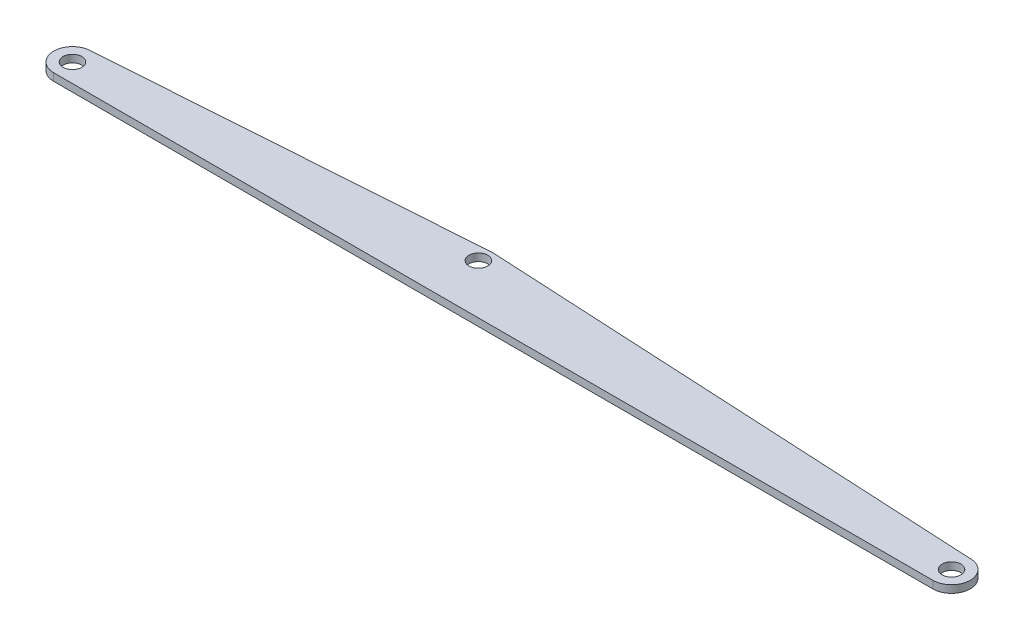
ISO-10303-21;
HEADER;
FILE_DESCRIPTION(('STEP AP214'),'2;1');
FILE_NAME('part.step','',(''),(''),'','','');
FILE_SCHEMA(('AUTOMOTIVE_DESIGN { 1 0 10303 214 1 1 1 1 }'));
ENDSEC;
DATA;
#1=APPLICATION_CONTEXT('core data for automotive mechanical design processes');
#2=APPLICATION_PROTOCOL_DEFINITION('international standard','automotive_design',2000,#1);
#3=PRODUCT_CONTEXT('',#1,'mechanical');
#4=PRODUCT('Part','Part','',(#3));
#5=PRODUCT_RELATED_PRODUCT_CATEGORY('part','',(#4));
#6=PRODUCT_DEFINITION_FORMATION('','',#4);
#7=PRODUCT_DEFINITION_CONTEXT('part definition',#1,'design');
#8=PRODUCT_DEFINITION('design','',#6,#7);
#9=PRODUCT_DEFINITION_SHAPE('','',#8);
#10=(LENGTH_UNIT() NAMED_UNIT(*) SI_UNIT(.MILLI.,.METRE.));
#11=(NAMED_UNIT(*) PLANE_ANGLE_UNIT() SI_UNIT($,.RADIAN.));
#12=(NAMED_UNIT(*) SI_UNIT($,.STERADIAN.) SOLID_ANGLE_UNIT());
#13=UNCERTAINTY_MEASURE_WITH_UNIT(LENGTH_MEASURE(1.E-05),#10,'distance_accuracy_value','');
#14=(GEOMETRIC_REPRESENTATION_CONTEXT(3) GLOBAL_UNCERTAINTY_ASSIGNED_CONTEXT((#13)) GLOBAL_UNIT_ASSIGNED_CONTEXT((#10,
#11,#12)) REPRESENTATION_CONTEXT('',''));
#15=CARTESIAN_POINT('',(0.,0.,0.));
#16=DIRECTION('',(0.,0.,1.));
#17=DIRECTION('',(1.,0.,0.));
#18=AXIS2_PLACEMENT_3D('',#15,#16,#17);
#19=CARTESIAN_POINT('',(0.,-5.08,0.));
#20=DIRECTION('',(0.,1.,0.));
#21=DIRECTION('',(0.,0.,1.));
#22=AXIS2_PLACEMENT_3D('',#19,#20,#21);
#23=CYLINDRICAL_SURFACE('',#22,12.7);
#24=CARTESIAN_POINT('',(0.,0.,0.));
#25=DIRECTION('',(0.,1.,0.));
#26=DIRECTION('',(0.,0.,-1.));
#27=AXIS2_PLACEMENT_3D('',#24,#25,#26);
#28=CIRCLE('',#27,12.7);
#29=CARTESIAN_POINT('',(0.,0.,12.7));
#30=VERTEX_POINT('',#29);
#31=CARTESIAN_POINT('',(0.,0.,-12.7));
#32=VERTEX_POINT('',#31);
#33=EDGE_CURVE('E127',#30,#32,#28,.T.);
#34=ORIENTED_EDGE('',*,*,#33,.F.);
#35=DIRECTION('',(0.,1.,0.));
#36=VECTOR('',#35,1.);
#37=CARTESIAN_POINT('',(0.,-5.08,12.7));
#38=LINE('',#37,#36);
#39=CARTESIAN_POINT('',(0.,-5.08,12.7));
#40=VERTEX_POINT('',#39);
#41=EDGE_CURVE('E11',#40,#30,#38,.T.);
#42=ORIENTED_EDGE('',*,*,#41,.F.);
#43=CARTESIAN_POINT('',(0.,-5.08,0.));
#44=DIRECTION('',(0.,1.,0.));
#45=DIRECTION('',(0.,0.,-1.));
#46=AXIS2_PLACEMENT_3D('',#43,#44,#45);
#47=CIRCLE('',#46,12.7);
#48=CARTESIAN_POINT('',(0.,-5.08,-12.7));
#49=VERTEX_POINT('',#48);
#50=EDGE_CURVE('E142',#40,#49,#47,.T.);
#51=ORIENTED_EDGE('',*,*,#50,.T.);
#52=DIRECTION('',(0.,1.,0.));
#53=VECTOR('',#52,1.);
#54=CARTESIAN_POINT('',(0.,-5.08,-12.7));
#55=LINE('',#54,#53);
#56=EDGE_CURVE('E45',#49,#32,#55,.T.);
#57=ORIENTED_EDGE('',*,*,#56,.T.);
#58=EDGE_LOOP('',(#34,#42,#51,#57));
#59=FACE_BOUND('',#58,.T.);
#60=ADVANCED_FACE('F42',(#59),#23,.T.);
#61=CARTESIAN_POINT('',(-595.5,-5.08,12.7));
#62=DIRECTION('',(0.,0.,1.));
#63=DIRECTION('',(1.,0.,0.));
#64=AXIS2_PLACEMENT_3D('',#61,#62,#63);
#65=PLANE('',#64);
#66=DIRECTION('',(1.,0.,0.));
#67=VECTOR('',#66,1.);
#68=CARTESIAN_POINT('',(-595.5,0.,12.7));
#69=LINE('',#68,#67);
#70=CARTESIAN_POINT('',(-595.5,0.,12.7));
#71=VERTEX_POINT('',#70);
#72=EDGE_CURVE('E140',#71,#30,#69,.T.);
#73=ORIENTED_EDGE('',*,*,#72,.F.);
#74=DIRECTION('',(0.,1.,0.));
#75=VECTOR('',#74,1.);
#76=CARTESIAN_POINT('',(-595.5,-5.08,12.7));
#77=LINE('',#76,#75);
#78=CARTESIAN_POINT('',(-595.5,-5.08,12.7));
#79=VERTEX_POINT('',#78);
#80=EDGE_CURVE('E51',#79,#71,#77,.T.);
#81=ORIENTED_EDGE('',*,*,#80,.F.);
#82=DIRECTION('',(1.,0.,0.));
#83=VECTOR('',#82,1.);
#84=CARTESIAN_POINT('',(-595.5,-5.08,12.7));
#85=LINE('',#84,#83);
#86=EDGE_CURVE('E117',#79,#40,#85,.T.);
#87=ORIENTED_EDGE('',*,*,#86,.T.);
#88=ORIENTED_EDGE('',*,*,#41,.T.);
#89=EDGE_LOOP('',(#73,#81,#87,#88));
#90=FACE_BOUND('',#89,.T.);
#91=ADVANCED_FACE('F150',(#90),#65,.T.);
#92=CARTESIAN_POINT('',(-595.5,-5.08,0.));
#93=DIRECTION('',(0.,1.,0.));
#94=DIRECTION('',(0.,0.,1.));
#95=AXIS2_PLACEMENT_3D('',#92,#93,#94);
#96=CYLINDRICAL_SURFACE('',#95,12.7);
#97=CARTESIAN_POINT('',(-595.5,0.,0.));
#98=DIRECTION('',(0.,1.,0.));
#99=DIRECTION('',(0.,0.,1.));
#100=AXIS2_PLACEMENT_3D('',#97,#98,#99);
#101=CIRCLE('',#100,12.7);
#102=CARTESIAN_POINT('',(-595.5,0.,-12.7));
#103=VERTEX_POINT('',#102);
#104=EDGE_CURVE('E104',#103,#71,#101,.T.);
#105=ORIENTED_EDGE('',*,*,#104,.F.);
#106=DIRECTION('',(0.,1.,0.));
#107=VECTOR('',#106,1.);
#108=CARTESIAN_POINT('',(-595.5,-5.08,-12.7));
#109=LINE('',#108,#107);
#110=CARTESIAN_POINT('',(-595.5,-5.08,-12.7));
#111=VERTEX_POINT('',#110);
#112=EDGE_CURVE('E99',#111,#103,#109,.T.);
#113=ORIENTED_EDGE('',*,*,#112,.F.);
#114=CARTESIAN_POINT('',(-595.5,-5.08,0.));
#115=DIRECTION('',(0.,1.,0.));
#116=DIRECTION('',(0.,0.,1.));
#117=AXIS2_PLACEMENT_3D('',#114,#115,#116);
#118=CIRCLE('',#117,12.7);
#119=EDGE_CURVE('E102',#111,#79,#118,.T.);
#120=ORIENTED_EDGE('',*,*,#119,.T.);
#121=ORIENTED_EDGE('',*,*,#80,.T.);
#122=EDGE_LOOP('',(#105,#113,#120,#121));
#123=FACE_BOUND('',#122,.T.);
#124=ADVANCED_FACE('F101',(#123),#96,.T.);
#125=CARTESIAN_POINT('',(-595.5,-5.08,-12.7));
#126=DIRECTION('',(-0.0697677852131993,0.,-0.997563259220409));
#127=DIRECTION('',(-0.997563259220409,0.,0.0697677852131993));
#128=AXIS2_PLACEMENT_3D('',#125,#126,#127);
#129=PLANE('',#128);
#130=DIRECTION('',(-0.997563259220409,0.,0.0697677852131993));
#131=VECTOR('',#130,1.);
#132=CARTESIAN_POINT('',(-595.5,0.,-12.7));
#133=LINE('',#132,#131);
#134=CARTESIAN_POINT('',(-342.124360605299,0.,-30.4206377882856));
#135=VERTEX_POINT('',#134);
#136=EDGE_CURVE('E137',#135,#103,#133,.T.);
#137=ORIENTED_EDGE('',*,*,#136,.F.);
#138=DIRECTION('',(0.,1.,0.));
#139=VECTOR('',#138,1.);
#140=CARTESIAN_POINT('',(-342.124360605299,-5.08,-30.4206377882856));
#141=LINE('',#140,#139);
#142=CARTESIAN_POINT('',(-342.124360605299,-5.08,-30.4206377882856));
#143=VERTEX_POINT('',#142);
#144=EDGE_CURVE('E109',#143,#135,#141,.T.);
#145=ORIENTED_EDGE('',*,*,#144,.F.);
#146=DIRECTION('',(-0.997563259220409,0.,0.0697677852131993));
#147=VECTOR('',#146,1.);
#148=CARTESIAN_POINT('',(-595.5,-5.08,-12.7));
#149=LINE('',#148,#147);
#150=EDGE_CURVE('E115',#143,#111,#149,.T.);
#151=ORIENTED_EDGE('',*,*,#150,.T.);
#152=ORIENTED_EDGE('',*,*,#112,.T.);
#153=EDGE_LOOP('',(#137,#145,#151,#152));
#154=FACE_BOUND('',#153,.T.);
#155=ADVANCED_FACE('F119',(#154),#129,.T.);
#156=CARTESIAN_POINT('',(-341.459822451144,-5.08,-20.9188477442112));
#157=DIRECTION('',(0.,1.,0.));
#158=DIRECTION('',(0.,0.,1.));
#159=AXIS2_PLACEMENT_3D('',#156,#157,#158);
#160=CYLINDRICAL_SURFACE('',#159,9.52499999999997);
#161=CARTESIAN_POINT('',(-341.459822451144,0.,-20.9188477442112));
#162=DIRECTION('',(0.,1.,0.));
#163=DIRECTION('',(0.,0.,1.));
#164=AXIS2_PLACEMENT_3D('',#161,#162,#163);
#165=CIRCLE('',#164,9.52499999999997);
#166=CARTESIAN_POINT('',(-340.965168314528,0.,-30.4309948354377));
#167=VERTEX_POINT('',#166);
#168=EDGE_CURVE('E134',#167,#135,#165,.T.);
#169=ORIENTED_EDGE('',*,*,#168,.F.);
#170=DIRECTION('',(0.,1.,0.));
#171=VECTOR('',#170,1.);
#172=CARTESIAN_POINT('',(-340.965168314528,-5.08,-30.4309948354377));
#173=LINE('',#172,#171);
#174=CARTESIAN_POINT('',(-340.965168314528,-5.08,-30.4309948354377));
#175=VERTEX_POINT('',#174);
#176=EDGE_CURVE('E145',#175,#167,#173,.T.);
#177=ORIENTED_EDGE('',*,*,#176,.F.);
#178=CARTESIAN_POINT('',(-341.459822451144,-5.08,-20.9188477442112));
#179=DIRECTION('',(0.,1.,0.));
#180=DIRECTION('',(0.,0.,1.));
#181=AXIS2_PLACEMENT_3D('',#178,#179,#180);
#182=CIRCLE('',#181,9.52499999999997);
#183=EDGE_CURVE('E120',#175,#143,#182,.T.);
#184=ORIENTED_EDGE('',*,*,#183,.T.);
#185=ORIENTED_EDGE('',*,*,#144,.T.);
#186=EDGE_LOOP('',(#169,#177,#184,#185));
#187=FACE_BOUND('',#186,.T.);
#188=ADVANCED_FACE('F163',(#187),#160,.T.);
#189=CARTESIAN_POINT('',(0.,-5.08,-12.7));
#190=DIRECTION('',(0.051932192820488,0.,-0.99865061325213));
#191=DIRECTION('',(-0.99865061325213,0.,-0.051932192820488));
#192=AXIS2_PLACEMENT_3D('',#189,#190,#191);
#193=PLANE('',#192);
#194=DIRECTION('',(-0.99865061325213,0.,-0.051932192820488));
#195=VECTOR('',#194,1.);
#196=CARTESIAN_POINT('',(0.,0.,-12.7));
#197=LINE('',#196,#195);
#198=EDGE_CURVE('E130',#32,#167,#197,.T.);
#199=ORIENTED_EDGE('',*,*,#198,.F.);
#200=ORIENTED_EDGE('',*,*,#56,.F.);
#201=DIRECTION('',(-0.99865061325213,0.,-0.051932192820488));
#202=VECTOR('',#201,1.);
#203=CARTESIAN_POINT('',(0.,-5.08,-12.7));
#204=LINE('',#203,#202);
#205=EDGE_CURVE('E122',#49,#175,#204,.T.);
#206=ORIENTED_EDGE('',*,*,#205,.T.);
#207=ORIENTED_EDGE('',*,*,#176,.T.);
#208=EDGE_LOOP('',(#199,#200,#206,#207));
#209=FACE_BOUND('',#208,.T.);
#210=ADVANCED_FACE('F147',(#209),#193,.T.);
#211=CARTESIAN_POINT('',(0.,-5.08,0.));
#212=DIRECTION('',(0.,-1.,0.));
#213=DIRECTION('',(0.,0.,-1.));
#214=AXIS2_PLACEMENT_3D('',#211,#212,#213);
#215=PLANE('',#214);
#216=CARTESIAN_POINT('',(-341.459822451144,-5.08,-20.9188477442112));
#217=DIRECTION('',(0.,1.,0.));
#218=DIRECTION('',(0.,0.,1.));
#219=AXIS2_PLACEMENT_3D('',#216,#217,#218);
#220=CIRCLE('',#219,6.35);
#221=CARTESIAN_POINT('',(-341.459822451144,-5.08,-14.5688477442112));
#222=VERTEX_POINT('',#221);
#223=EDGE_CURVE('E193',#222,#222,#220,.T.);
#224=ORIENTED_EDGE('',*,*,#223,.T.);
#225=EDGE_LOOP('',(#224));
#226=FACE_BOUND('',#225,.T.);
#227=CARTESIAN_POINT('',(-595.5,-5.08,0.));
#228=DIRECTION('',(0.,1.,0.));
#229=DIRECTION('',(0.,0.,1.));
#230=AXIS2_PLACEMENT_3D('',#227,#228,#229);
#231=CIRCLE('',#230,6.34999999999994);
#232=CARTESIAN_POINT('',(-595.5,-5.08,6.34999999999994));
#233=VERTEX_POINT('',#232);
#234=EDGE_CURVE('E201',#233,#233,#231,.T.);
#235=ORIENTED_EDGE('',*,*,#234,.T.);
#236=EDGE_LOOP('',(#235));
#237=FACE_BOUND('',#236,.T.);
#238=CARTESIAN_POINT('',(0.,-5.08,0.));
#239=DIRECTION('',(0.,1.,0.));
#240=DIRECTION('',(0.,0.,1.));
#241=AXIS2_PLACEMENT_3D('',#238,#239,#240);
#242=CIRCLE('',#241,6.35);
#243=CARTESIAN_POINT('',(0.,-5.08,6.35));
#244=VERTEX_POINT('',#243);
#245=EDGE_CURVE('E131',#244,#244,#242,.T.);
#246=ORIENTED_EDGE('',*,*,#245,.T.);
#247=EDGE_LOOP('',(#246));
#248=FACE_BOUND('',#247,.T.);
#249=ORIENTED_EDGE('',*,*,#50,.F.);
#250=ORIENTED_EDGE('',*,*,#86,.F.);
#251=ORIENTED_EDGE('',*,*,#119,.F.);
#252=ORIENTED_EDGE('',*,*,#150,.F.);
#253=ORIENTED_EDGE('',*,*,#183,.F.);
#254=ORIENTED_EDGE('',*,*,#205,.F.);
#255=EDGE_LOOP('',(#249,#250,#251,#252,#253,#254));
#256=FACE_BOUND('',#255,.T.);
#257=ADVANCED_FACE('F113',(#226,#237,#248,#256),#215,.T.);
#258=CARTESIAN_POINT('',(0.,0.,0.));
#259=DIRECTION('',(0.,-1.,0.));
#260=DIRECTION('',(0.,0.,-1.));
#261=AXIS2_PLACEMENT_3D('',#258,#259,#260);
#262=PLANE('',#261);
#263=CARTESIAN_POINT('',(-341.459822451144,0.,-20.9188477442112));
#264=DIRECTION('',(0.,1.,0.));
#265=DIRECTION('',(0.,0.,1.));
#266=AXIS2_PLACEMENT_3D('',#263,#264,#265);
#267=CIRCLE('',#266,6.35);
#268=CARTESIAN_POINT('',(-341.459822451144,0.,-14.5688477442112));
#269=VERTEX_POINT('',#268);
#270=EDGE_CURVE('E196',#269,#269,#267,.T.);
#271=ORIENTED_EDGE('',*,*,#270,.F.);
#272=EDGE_LOOP('',(#271));
#273=FACE_BOUND('',#272,.T.);
#274=CARTESIAN_POINT('',(-595.5,0.,0.));
#275=DIRECTION('',(0.,1.,0.));
#276=DIRECTION('',(0.,0.,1.));
#277=AXIS2_PLACEMENT_3D('',#274,#275,#276);
#278=CIRCLE('',#277,6.34999999999994);
#279=CARTESIAN_POINT('',(-595.5,0.,6.34999999999994));
#280=VERTEX_POINT('',#279);
#281=EDGE_CURVE('E198',#280,#280,#278,.T.);
#282=ORIENTED_EDGE('',*,*,#281,.F.);
#283=EDGE_LOOP('',(#282));
#284=FACE_BOUND('',#283,.T.);
#285=CARTESIAN_POINT('',(0.,0.,0.));
#286=DIRECTION('',(0.,1.,0.));
#287=DIRECTION('',(0.,0.,1.));
#288=AXIS2_PLACEMENT_3D('',#285,#286,#287);
#289=CIRCLE('',#288,6.35);
#290=CARTESIAN_POINT('',(0.,0.,6.35));
#291=VERTEX_POINT('',#290);
#292=EDGE_CURVE('E204',#291,#291,#289,.T.);
#293=ORIENTED_EDGE('',*,*,#292,.F.);
#294=EDGE_LOOP('',(#293));
#295=FACE_BOUND('',#294,.T.);
#296=ORIENTED_EDGE('',*,*,#33,.T.);
#297=ORIENTED_EDGE('',*,*,#198,.T.);
#298=ORIENTED_EDGE('',*,*,#168,.T.);
#299=ORIENTED_EDGE('',*,*,#136,.T.);
#300=ORIENTED_EDGE('',*,*,#104,.T.);
#301=ORIENTED_EDGE('',*,*,#72,.T.);
#302=EDGE_LOOP('',(#296,#297,#298,#299,#300,#301));
#303=FACE_BOUND('',#302,.T.);
#304=ADVANCED_FACE('F149',(#273,#284,#295,#303),#262,.F.);
#305=CARTESIAN_POINT('',(0.,-5.08,0.));
#306=DIRECTION('',(0.,1.,0.));
#307=DIRECTION('',(0.,0.,1.));
#308=AXIS2_PLACEMENT_3D('',#305,#306,#307);
#309=CYLINDRICAL_SURFACE('',#308,6.35);
#310=ORIENTED_EDGE('',*,*,#245,.F.);
#311=EDGE_LOOP('',(#310));
#312=FACE_BOUND('',#311,.T.);
#313=ORIENTED_EDGE('',*,*,#292,.T.);
#314=EDGE_LOOP('',(#313));
#315=FACE_BOUND('',#314,.T.);
#316=ADVANCED_FACE('F174',(#312,#315),#309,.F.);
#317=CARTESIAN_POINT('',(-595.5,-5.08,0.));
#318=DIRECTION('',(0.,1.,0.));
#319=DIRECTION('',(0.,0.,1.));
#320=AXIS2_PLACEMENT_3D('',#317,#318,#319);
#321=CYLINDRICAL_SURFACE('',#320,6.34999999999994);
#322=ORIENTED_EDGE('',*,*,#234,.F.);
#323=EDGE_LOOP('',(#322));
#324=FACE_BOUND('',#323,.T.);
#325=ORIENTED_EDGE('',*,*,#281,.T.);
#326=EDGE_LOOP('',(#325));
#327=FACE_BOUND('',#326,.T.);
#328=ADVANCED_FACE('F181',(#324,#327),#321,.F.);
#329=CARTESIAN_POINT('',(-341.459822451144,-5.08,-20.9188477442112));
#330=DIRECTION('',(0.,1.,0.));
#331=DIRECTION('',(0.,0.,1.));
#332=AXIS2_PLACEMENT_3D('',#329,#330,#331);
#333=CYLINDRICAL_SURFACE('',#332,6.35);
#334=ORIENTED_EDGE('',*,*,#223,.F.);
#335=EDGE_LOOP('',(#334));
#336=FACE_BOUND('',#335,.T.);
#337=ORIENTED_EDGE('',*,*,#270,.T.);
#338=EDGE_LOOP('',(#337));
#339=FACE_BOUND('',#338,.T.);
#340=ADVANCED_FACE('F185',(#336,#339),#333,.F.);
#341=CLOSED_SHELL('',(#60,#91,#124,#155,#188,#210,#257,#304,#316,#328,#340));
#342=MANIFOLD_SOLID_BREP('B2',#341);
#343=ADVANCED_BREP_SHAPE_REPRESENTATION('',(#18,#342),#14);
#344=SHAPE_DEFINITION_REPRESENTATION(#9,#343);
ENDSEC;
END-ISO-10303-21;
